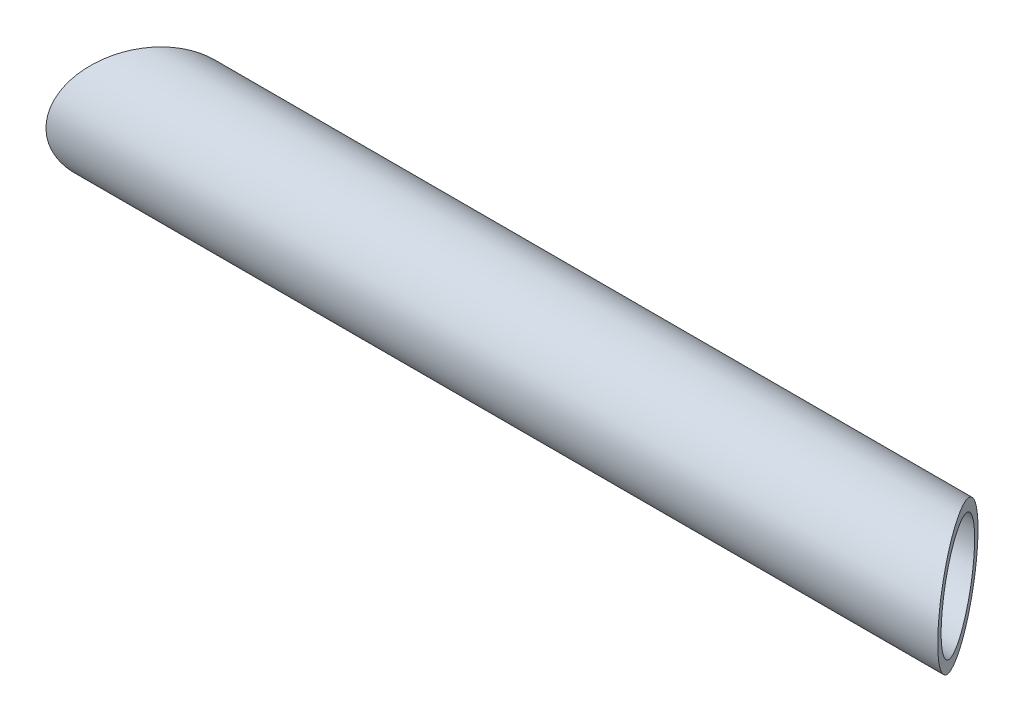
ISO-10303-21;
HEADER;
FILE_DESCRIPTION(('STEP AP214'),'2;1');
FILE_NAME('part.step','',(''),(''),'','','');
FILE_SCHEMA(('AUTOMOTIVE_DESIGN { 1 0 10303 214 1 1 1 1 }'));
ENDSEC;
DATA;
#1=APPLICATION_CONTEXT('core data for automotive mechanical design processes');
#2=APPLICATION_PROTOCOL_DEFINITION('international standard','automotive_design',2000,#1);
#3=PRODUCT_CONTEXT('',#1,'mechanical');
#4=PRODUCT('Part','Part','',(#3));
#5=PRODUCT_RELATED_PRODUCT_CATEGORY('part','',(#4));
#6=PRODUCT_DEFINITION_FORMATION('','',#4);
#7=PRODUCT_DEFINITION_CONTEXT('part definition',#1,'design');
#8=PRODUCT_DEFINITION('design','',#6,#7);
#9=PRODUCT_DEFINITION_SHAPE('','',#8);
#10=(LENGTH_UNIT() NAMED_UNIT(*) SI_UNIT(.MILLI.,.METRE.));
#11=(NAMED_UNIT(*) PLANE_ANGLE_UNIT() SI_UNIT($,.RADIAN.));
#12=(NAMED_UNIT(*) SI_UNIT($,.STERADIAN.) SOLID_ANGLE_UNIT());
#13=UNCERTAINTY_MEASURE_WITH_UNIT(LENGTH_MEASURE(1.E-05),#10,'distance_accuracy_value','');
#14=(GEOMETRIC_REPRESENTATION_CONTEXT(3) GLOBAL_UNCERTAINTY_ASSIGNED_CONTEXT((#13)) GLOBAL_UNIT_ASSIGNED_CONTEXT((#10,
#11,#12)) REPRESENTATION_CONTEXT('',''));
#15=CARTESIAN_POINT('',(0.,0.,0.));
#16=DIRECTION('',(0.,0.,1.));
#17=DIRECTION('',(1.,0.,0.));
#18=AXIS2_PLACEMENT_3D('',#15,#16,#17);
#19=CARTESIAN_POINT('',(-65.,0.,0.));
#20=DIRECTION('',(1.,0.,0.));
#21=DIRECTION('',(0.,0.,-1.));
#22=AXIS2_PLACEMENT_3D('',#19,#20,#21);
#23=CYLINDRICAL_SURFACE('',#22,7.9);
#24=CARTESIAN_POINT('',(-65.,0.,0.));
#25=DIRECTION('',(-0.834008585191079,0.,-0.551751465632466));
#26=DIRECTION('',(0.551751465632466,0.,-0.834008585191079));
#27=AXIS2_PLACEMENT_3D('',#24,#25,#26);
#28=ELLIPSE('',#27,9.47232455429705,7.9);
#29=CARTESIAN_POINT('',(-59.7736310442202,0.,-7.89999999999999));
#30=VERTEX_POINT('',#29);
#31=EDGE_CURVE('E51',#30,#30,#28,.T.);
#32=ORIENTED_EDGE('',*,*,#31,.T.);
#33=EDGE_LOOP('',(#32));
#34=FACE_BOUND('',#33,.T.);
#35=CARTESIAN_POINT('',(65.,0.,0.));
#36=DIRECTION('',(0.834008585191079,0.,-0.551751465632466));
#37=DIRECTION('',(0.551751465632466,0.,0.834008585191079));
#38=AXIS2_PLACEMENT_3D('',#35,#36,#37);
#39=ELLIPSE('',#38,9.47232455429705,7.9);
#40=CARTESIAN_POINT('',(70.2263689557798,0.,7.90000000000002));
#41=VERTEX_POINT('',#40);
#42=EDGE_CURVE('E41',#41,#41,#39,.T.);
#43=ORIENTED_EDGE('',*,*,#42,.T.);
#44=EDGE_LOOP('',(#43));
#45=FACE_BOUND('',#44,.T.);
#46=ADVANCED_FACE('F37',(#34,#45),#23,.F.);
#47=CARTESIAN_POINT('',(-65.,0.,0.));
#48=DIRECTION('',(1.,0.,0.));
#49=DIRECTION('',(0.,0.,-1.));
#50=AXIS2_PLACEMENT_3D('',#47,#48,#49);
#51=CYLINDRICAL_SURFACE('',#50,9.5);
#52=CARTESIAN_POINT('',(-65.,0.,0.));
#53=DIRECTION('',(-0.834008585191079,0.,-0.551751465632466));
#54=DIRECTION('',(0.551751465632466,0.,-0.834008585191079));
#55=AXIS2_PLACEMENT_3D('',#52,#53,#54);
#56=ELLIPSE('',#55,11.3907700336483,9.5);
#57=CARTESIAN_POINT('',(-58.7151259392522,0.,-9.49999999999998));
#58=VERTEX_POINT('',#57);
#59=EDGE_CURVE('E45',#58,#58,#56,.T.);
#60=ORIENTED_EDGE('',*,*,#59,.F.);
#61=EDGE_LOOP('',(#60));
#62=FACE_BOUND('',#61,.T.);
#63=CARTESIAN_POINT('',(65.,0.,0.));
#64=DIRECTION('',(0.834008585191079,0.,-0.551751465632466));
#65=DIRECTION('',(0.551751465632466,0.,0.834008585191079));
#66=AXIS2_PLACEMENT_3D('',#63,#64,#65);
#67=ELLIPSE('',#66,11.3907700336483,9.5);
#68=CARTESIAN_POINT('',(71.2848740607479,0.,9.50000000000001));
#69=VERTEX_POINT('',#68);
#70=EDGE_CURVE('E10',#69,#69,#67,.T.);
#71=ORIENTED_EDGE('',*,*,#70,.F.);
#72=EDGE_LOOP('',(#71));
#73=FACE_BOUND('',#72,.T.);
#74=ADVANCED_FACE('F65',(#62,#73),#51,.T.);
#75=CARTESIAN_POINT('',(-65.,0.,0.));
#76=DIRECTION('',(-0.834008585191079,0.,-0.551751465632466));
#77=DIRECTION('',(-0.551751465632466,0.,0.834008585191079));
#78=AXIS2_PLACEMENT_3D('',#75,#76,#77);
#79=PLANE('',#78);
#80=ORIENTED_EDGE('',*,*,#31,.F.);
#81=EDGE_LOOP('',(#80));
#82=FACE_BOUND('',#81,.T.);
#83=ORIENTED_EDGE('',*,*,#59,.T.);
#84=EDGE_LOOP('',(#83));
#85=FACE_BOUND('',#84,.T.);
#86=ADVANCED_FACE('F60',(#82,#85),#79,.T.);
#87=CARTESIAN_POINT('',(65.,0.,0.));
#88=DIRECTION('',(0.834008585191079,0.,-0.551751465632466));
#89=DIRECTION('',(-0.551751465632466,0.,-0.834008585191079));
#90=AXIS2_PLACEMENT_3D('',#87,#88,#89);
#91=PLANE('',#90);
#92=ORIENTED_EDGE('',*,*,#42,.F.);
#93=EDGE_LOOP('',(#92));
#94=FACE_BOUND('',#93,.T.);
#95=ORIENTED_EDGE('',*,*,#70,.T.);
#96=EDGE_LOOP('',(#95));
#97=FACE_BOUND('',#96,.T.);
#98=ADVANCED_FACE('F39',(#94,#97),#91,.T.);
#99=CLOSED_SHELL('',(#46,#74,#86,#98));
#100=MANIFOLD_SOLID_BREP('B2',#99);
#101=ADVANCED_BREP_SHAPE_REPRESENTATION('',(#18,#100),#14);
#102=SHAPE_DEFINITION_REPRESENTATION(#9,#101);
ENDSEC;
END-ISO-10303-21;
